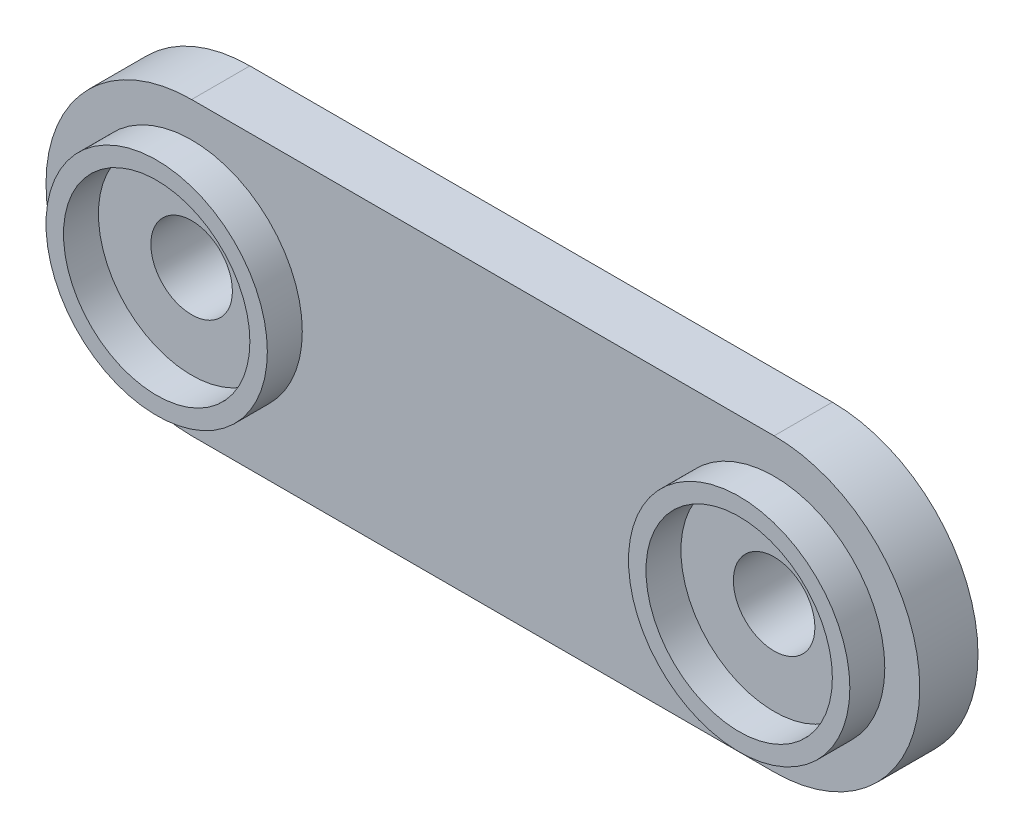
ISO-10303-21;
HEADER;
FILE_DESCRIPTION(('STEP AP214'),'2;1');
FILE_NAME('part.step','',(''),(''),'','','');
FILE_SCHEMA(('AUTOMOTIVE_DESIGN { 1 0 10303 214 1 1 1 1 }'));
ENDSEC;
DATA;
#1=APPLICATION_CONTEXT('core data for automotive mechanical design processes');
#2=APPLICATION_PROTOCOL_DEFINITION('international standard','automotive_design',2000,#1);
#3=PRODUCT_CONTEXT('',#1,'mechanical');
#4=PRODUCT('Part','Part','',(#3));
#5=PRODUCT_RELATED_PRODUCT_CATEGORY('part','',(#4));
#6=PRODUCT_DEFINITION_FORMATION('','',#4);
#7=PRODUCT_DEFINITION_CONTEXT('part definition',#1,'design');
#8=PRODUCT_DEFINITION('design','',#6,#7);
#9=PRODUCT_DEFINITION_SHAPE('','',#8);
#10=(LENGTH_UNIT() NAMED_UNIT(*) SI_UNIT(.MILLI.,.METRE.));
#11=(NAMED_UNIT(*) PLANE_ANGLE_UNIT() SI_UNIT($,.RADIAN.));
#12=(NAMED_UNIT(*) SI_UNIT($,.STERADIAN.) SOLID_ANGLE_UNIT());
#13=UNCERTAINTY_MEASURE_WITH_UNIT(LENGTH_MEASURE(1.E-05),#10,'distance_accuracy_value','');
#14=(GEOMETRIC_REPRESENTATION_CONTEXT(3) GLOBAL_UNCERTAINTY_ASSIGNED_CONTEXT((#13)) GLOBAL_UNIT_ASSIGNED_CONTEXT((#10,
#11,#12)) REPRESENTATION_CONTEXT('',''));
#15=CARTESIAN_POINT('',(0.,0.,0.));
#16=DIRECTION('',(0.,0.,1.));
#17=DIRECTION('',(1.,0.,0.));
#18=AXIS2_PLACEMENT_3D('',#15,#16,#17);
#19=CARTESIAN_POINT('',(0.,0.,5.));
#20=DIRECTION('',(0.,0.,1.));
#21=DIRECTION('',(1.,0.,0.));
#22=AXIS2_PLACEMENT_3D('',#19,#20,#21);
#23=PLANE('',#22);
#24=DIRECTION('',(1.,0.,0.));
#25=VECTOR('',#24,1.);
#26=CARTESIAN_POINT('',(0.,25.,5.));
#27=LINE('',#26,#25);
#28=CARTESIAN_POINT('',(0.,25.,5.));
#29=VERTEX_POINT('',#28);
#30=CARTESIAN_POINT('',(50.,25.,5.));
#31=VERTEX_POINT('',#30);
#32=EDGE_CURVE('E139',#29,#31,#27,.T.);
#33=ORIENTED_EDGE('',*,*,#32,.F.);
#34=CARTESIAN_POINT('',(0.,12.5,5.));
#35=DIRECTION('',(0.,0.,1.));
#36=DIRECTION('',(1.,0.,0.));
#37=AXIS2_PLACEMENT_3D('',#34,#35,#36);
#38=CIRCLE('',#37,12.5);
#39=CARTESIAN_POINT('',(0.,0.,5.));
#40=VERTEX_POINT('',#39);
#41=EDGE_CURVE('E138',#29,#40,#38,.T.);
#42=ORIENTED_EDGE('',*,*,#41,.T.);
#43=DIRECTION('',(1.,0.,0.));
#44=VECTOR('',#43,1.);
#45=CARTESIAN_POINT('',(0.,0.,5.));
#46=LINE('',#45,#44);
#47=CARTESIAN_POINT('',(50.,0.,5.));
#48=VERTEX_POINT('',#47);
#49=EDGE_CURVE('E125',#40,#48,#46,.T.);
#50=ORIENTED_EDGE('',*,*,#49,.T.);
#51=CARTESIAN_POINT('',(50.,12.5,5.));
#52=DIRECTION('',(0.,0.,1.));
#53=DIRECTION('',(1.,0.,0.));
#54=AXIS2_PLACEMENT_3D('',#51,#52,#53);
#55=CIRCLE('',#54,12.5);
#56=EDGE_CURVE('E130',#48,#31,#55,.T.);
#57=ORIENTED_EDGE('',*,*,#56,.T.);
#58=EDGE_LOOP('',(#33,#42,#50,#57));
#59=FACE_BOUND('',#58,.T.);
#60=CARTESIAN_POINT('',(50.,12.5,5.));
#61=DIRECTION('',(0.,0.,1.));
#62=DIRECTION('',(1.,0.,0.));
#63=AXIS2_PLACEMENT_3D('',#60,#61,#62);
#64=CIRCLE('',#63,9.5);
#65=CARTESIAN_POINT('',(59.5,12.5,5.));
#66=VERTEX_POINT('',#65);
#67=EDGE_CURVE('E227',#66,#66,#64,.T.);
#68=ORIENTED_EDGE('',*,*,#67,.F.);
#69=EDGE_LOOP('',(#68));
#70=FACE_BOUND('',#69,.T.);
#71=CARTESIAN_POINT('',(0.,12.5,5.));
#72=DIRECTION('',(0.,0.,1.));
#73=DIRECTION('',(1.,0.,0.));
#74=AXIS2_PLACEMENT_3D('',#71,#72,#73);
#75=CIRCLE('',#74,9.5);
#76=CARTESIAN_POINT('',(9.5,12.5,5.));
#77=VERTEX_POINT('',#76);
#78=EDGE_CURVE('E12',#77,#77,#75,.T.);
#79=ORIENTED_EDGE('',*,*,#78,.F.);
#80=EDGE_LOOP('',(#79));
#81=FACE_BOUND('',#80,.T.);
#82=ADVANCED_FACE('F74',(#59,#70,#81),#23,.T.);
#83=CARTESIAN_POINT('',(50.,12.5,5.));
#84=DIRECTION('',(0.,0.,1.));
#85=DIRECTION('',(1.,0.,0.));
#86=AXIS2_PLACEMENT_3D('',#83,#84,#85);
#87=CIRCLE('',#86,3.5);
#88=CARTESIAN_POINT('',(53.5,12.5,5.));
#89=VERTEX_POINT('',#88);
#90=EDGE_CURVE('E159',#89,#89,#87,.T.);
#91=ORIENTED_EDGE('',*,*,#90,.F.);
#92=EDGE_LOOP('',(#91));
#93=FACE_BOUND('',#92,.T.);
#94=CARTESIAN_POINT('',(50.,12.5,5.));
#95=DIRECTION('',(0.,0.,1.));
#96=DIRECTION('',(1.,0.,0.));
#97=AXIS2_PLACEMENT_3D('',#94,#95,#96);
#98=CIRCLE('',#97,8.);
#99=CARTESIAN_POINT('',(58.,12.5,5.));
#100=VERTEX_POINT('',#99);
#101=EDGE_CURVE('E78',#100,#100,#98,.F.);
#102=ORIENTED_EDGE('',*,*,#101,.F.);
#103=EDGE_LOOP('',(#102));
#104=FACE_BOUND('',#103,.T.);
#105=ADVANCED_FACE('F172',(#93,#104),#23,.T.);
#106=CARTESIAN_POINT('',(0.,25.,5.));
#107=DIRECTION('',(0.,1.,0.));
#108=DIRECTION('',(-1.,0.,0.));
#109=AXIS2_PLACEMENT_3D('',#106,#107,#108);
#110=PLANE('',#109);
#111=DIRECTION('',(1.,0.,0.));
#112=VECTOR('',#111,1.);
#113=CARTESIAN_POINT('',(0.,25.,0.));
#114=LINE('',#113,#112);
#115=CARTESIAN_POINT('',(0.,25.,0.));
#116=VERTEX_POINT('',#115);
#117=CARTESIAN_POINT('',(50.,25.,0.));
#118=VERTEX_POINT('',#117);
#119=EDGE_CURVE('E145',#116,#118,#114,.T.);
#120=ORIENTED_EDGE('',*,*,#119,.F.);
#121=DIRECTION('',(0.,0.,-1.));
#122=VECTOR('',#121,1.);
#123=CARTESIAN_POINT('',(0.,25.,5.));
#124=LINE('',#123,#122);
#125=EDGE_CURVE('E92',#29,#116,#124,.T.);
#126=ORIENTED_EDGE('',*,*,#125,.F.);
#127=ORIENTED_EDGE('',*,*,#32,.T.);
#128=DIRECTION('',(0.,0.,-1.));
#129=VECTOR('',#128,1.);
#130=CARTESIAN_POINT('',(50.,25.,5.));
#131=LINE('',#130,#129);
#132=EDGE_CURVE('E119',#31,#118,#131,.T.);
#133=ORIENTED_EDGE('',*,*,#132,.T.);
#134=EDGE_LOOP('',(#120,#126,#127,#133));
#135=FACE_BOUND('',#134,.T.);
#136=ADVANCED_FACE('F175',(#135),#110,.T.);
#137=CARTESIAN_POINT('',(0.,0.,5.));
#138=DIRECTION('',(0.,1.,0.));
#139=DIRECTION('',(-1.,0.,0.));
#140=AXIS2_PLACEMENT_3D('',#137,#138,#139);
#141=PLANE('',#140);
#142=DIRECTION('',(1.,0.,0.));
#143=VECTOR('',#142,1.);
#144=CARTESIAN_POINT('',(0.,0.,0.));
#145=LINE('',#144,#143);
#146=CARTESIAN_POINT('',(0.,0.,0.));
#147=VERTEX_POINT('',#146);
#148=CARTESIAN_POINT('',(50.,0.,0.));
#149=VERTEX_POINT('',#148);
#150=EDGE_CURVE('E127',#147,#149,#145,.T.);
#151=ORIENTED_EDGE('',*,*,#150,.T.);
#152=DIRECTION('',(0.,0.,-1.));
#153=VECTOR('',#152,1.);
#154=CARTESIAN_POINT('',(50.,0.,5.));
#155=LINE('',#154,#153);
#156=EDGE_CURVE('E122',#48,#149,#155,.T.);
#157=ORIENTED_EDGE('',*,*,#156,.F.);
#158=ORIENTED_EDGE('',*,*,#49,.F.);
#159=DIRECTION('',(0.,0.,-1.));
#160=VECTOR('',#159,1.);
#161=CARTESIAN_POINT('',(0.,0.,5.));
#162=LINE('',#161,#160);
#163=EDGE_CURVE('E109',#40,#147,#162,.T.);
#164=ORIENTED_EDGE('',*,*,#163,.T.);
#165=EDGE_LOOP('',(#151,#157,#158,#164));
#166=FACE_BOUND('',#165,.T.);
#167=ADVANCED_FACE('F123',(#166),#141,.F.);
#168=CARTESIAN_POINT('',(0.,0.,0.));
#169=DIRECTION('',(0.,0.,1.));
#170=DIRECTION('',(1.,0.,0.));
#171=AXIS2_PLACEMENT_3D('',#168,#169,#170);
#172=PLANE('',#171);
#173=CARTESIAN_POINT('',(0.,12.5,0.));
#174=DIRECTION('',(0.,0.,1.));
#175=DIRECTION('',(1.,0.,0.));
#176=AXIS2_PLACEMENT_3D('',#173,#174,#175);
#177=CIRCLE('',#176,3.5);
#178=CARTESIAN_POINT('',(3.5,12.5,0.));
#179=VERTEX_POINT('',#178);
#180=EDGE_CURVE('E152',#179,#179,#177,.F.);
#181=ORIENTED_EDGE('',*,*,#180,.F.);
#182=EDGE_LOOP('',(#181));
#183=FACE_BOUND('',#182,.T.);
#184=CARTESIAN_POINT('',(50.,12.5,0.));
#185=DIRECTION('',(0.,0.,1.));
#186=DIRECTION('',(1.,0.,0.));
#187=AXIS2_PLACEMENT_3D('',#184,#185,#186);
#188=CIRCLE('',#187,3.5);
#189=CARTESIAN_POINT('',(53.5,12.5,0.));
#190=VERTEX_POINT('',#189);
#191=EDGE_CURVE('E163',#190,#190,#188,.F.);
#192=ORIENTED_EDGE('',*,*,#191,.F.);
#193=EDGE_LOOP('',(#192));
#194=FACE_BOUND('',#193,.T.);
#195=ORIENTED_EDGE('',*,*,#150,.F.);
#196=CARTESIAN_POINT('',(0.,12.5,0.));
#197=DIRECTION('',(0.,0.,1.));
#198=DIRECTION('',(1.,0.,0.));
#199=AXIS2_PLACEMENT_3D('',#196,#197,#198);
#200=CIRCLE('',#199,12.5);
#201=EDGE_CURVE('E133',#116,#147,#200,.T.);
#202=ORIENTED_EDGE('',*,*,#201,.F.);
#203=ORIENTED_EDGE('',*,*,#119,.T.);
#204=CARTESIAN_POINT('',(50.,12.5,0.));
#205=DIRECTION('',(0.,0.,1.));
#206=DIRECTION('',(1.,0.,0.));
#207=AXIS2_PLACEMENT_3D('',#204,#205,#206);
#208=CIRCLE('',#207,12.5);
#209=EDGE_CURVE('E134',#149,#118,#208,.T.);
#210=ORIENTED_EDGE('',*,*,#209,.F.);
#211=EDGE_LOOP('',(#195,#202,#203,#210));
#212=FACE_BOUND('',#211,.T.);
#213=ADVANCED_FACE('F203',(#183,#194,#212),#172,.F.);
#214=CARTESIAN_POINT('',(0.,12.5,5.));
#215=DIRECTION('',(0.,0.,1.));
#216=DIRECTION('',(1.,0.,0.));
#217=AXIS2_PLACEMENT_3D('',#214,#215,#216);
#218=CIRCLE('',#217,8.);
#219=CARTESIAN_POINT('',(8.,12.5,5.));
#220=VERTEX_POINT('',#219);
#221=EDGE_CURVE('E214',#220,#220,#218,.T.);
#222=ORIENTED_EDGE('',*,*,#221,.T.);
#223=EDGE_LOOP('',(#222));
#224=FACE_BOUND('',#223,.T.);
#225=CARTESIAN_POINT('',(0.,12.5,5.));
#226=DIRECTION('',(0.,0.,1.));
#227=DIRECTION('',(1.,0.,0.));
#228=AXIS2_PLACEMENT_3D('',#225,#226,#227);
#229=CIRCLE('',#228,3.5);
#230=CARTESIAN_POINT('',(3.5,12.5,5.));
#231=VERTEX_POINT('',#230);
#232=EDGE_CURVE('E154',#231,#231,#229,.T.);
#233=ORIENTED_EDGE('',*,*,#232,.F.);
#234=EDGE_LOOP('',(#233));
#235=FACE_BOUND('',#234,.T.);
#236=ADVANCED_FACE('F177',(#224,#235),#23,.T.);
#237=CARTESIAN_POINT('',(50.,12.5,5.));
#238=DIRECTION('',(0.,0.,-1.));
#239=DIRECTION('',(-1.,0.,0.));
#240=AXIS2_PLACEMENT_3D('',#237,#238,#239);
#241=CYLINDRICAL_SURFACE('',#240,12.5);
#242=ORIENTED_EDGE('',*,*,#209,.T.);
#243=ORIENTED_EDGE('',*,*,#132,.F.);
#244=ORIENTED_EDGE('',*,*,#56,.F.);
#245=ORIENTED_EDGE('',*,*,#156,.T.);
#246=EDGE_LOOP('',(#242,#243,#244,#245));
#247=FACE_BOUND('',#246,.T.);
#248=ADVANCED_FACE('F76',(#247),#241,.T.);
#249=CARTESIAN_POINT('',(0.,12.5,5.));
#250=DIRECTION('',(0.,0.,-1.));
#251=DIRECTION('',(-1.,0.,0.));
#252=AXIS2_PLACEMENT_3D('',#249,#250,#251);
#253=CYLINDRICAL_SURFACE('',#252,12.5);
#254=ORIENTED_EDGE('',*,*,#125,.T.);
#255=ORIENTED_EDGE('',*,*,#201,.T.);
#256=ORIENTED_EDGE('',*,*,#163,.F.);
#257=ORIENTED_EDGE('',*,*,#41,.F.);
#258=EDGE_LOOP('',(#254,#255,#256,#257));
#259=FACE_BOUND('',#258,.T.);
#260=ADVANCED_FACE('F208',(#259),#253,.T.);
#261=CARTESIAN_POINT('',(50.,12.5,-0.00100000000000013));
#262=DIRECTION('',(0.,0.,1.));
#263=DIRECTION('',(1.,0.,0.));
#264=AXIS2_PLACEMENT_3D('',#261,#262,#263);
#265=CYLINDRICAL_SURFACE('',#264,3.5);
#266=ORIENTED_EDGE('',*,*,#90,.T.);
#267=EDGE_LOOP('',(#266));
#268=FACE_BOUND('',#267,.T.);
#269=ORIENTED_EDGE('',*,*,#191,.T.);
#270=EDGE_LOOP('',(#269));
#271=FACE_BOUND('',#270,.T.);
#272=ADVANCED_FACE('F169',(#268,#271),#265,.F.);
#273=CARTESIAN_POINT('',(0.,12.5,-0.00100000000000013));
#274=DIRECTION('',(0.,0.,1.));
#275=DIRECTION('',(1.,0.,0.));
#276=AXIS2_PLACEMENT_3D('',#273,#274,#275);
#277=CYLINDRICAL_SURFACE('',#276,3.5);
#278=ORIENTED_EDGE('',*,*,#232,.T.);
#279=EDGE_LOOP('',(#278));
#280=FACE_BOUND('',#279,.T.);
#281=ORIENTED_EDGE('',*,*,#180,.T.);
#282=EDGE_LOOP('',(#281));
#283=FACE_BOUND('',#282,.T.);
#284=ADVANCED_FACE('F184',(#280,#283),#277,.F.);
#285=CARTESIAN_POINT('',(50.,12.5,8.));
#286=DIRECTION('',(0.,0.,-1.));
#287=DIRECTION('',(-1.,0.,0.));
#288=AXIS2_PLACEMENT_3D('',#285,#286,#287);
#289=CYLINDRICAL_SURFACE('',#288,8.);
#290=CARTESIAN_POINT('',(50.,12.5,8.));
#291=DIRECTION('',(0.,0.,1.));
#292=DIRECTION('',(1.,0.,0.));
#293=AXIS2_PLACEMENT_3D('',#290,#291,#292);
#294=CIRCLE('',#293,8.);
#295=CARTESIAN_POINT('',(58.,12.5,8.));
#296=VERTEX_POINT('',#295);
#297=EDGE_CURVE('E223',#296,#296,#294,.T.);
#298=ORIENTED_EDGE('',*,*,#297,.T.);
#299=EDGE_LOOP('',(#298));
#300=FACE_BOUND('',#299,.T.);
#301=ORIENTED_EDGE('',*,*,#101,.T.);
#302=EDGE_LOOP('',(#301));
#303=FACE_BOUND('',#302,.T.);
#304=ADVANCED_FACE('F181',(#300,#303),#289,.F.);
#305=CARTESIAN_POINT('',(50.,12.5,8.));
#306=DIRECTION('',(0.,0.,-1.));
#307=DIRECTION('',(-1.,0.,0.));
#308=AXIS2_PLACEMENT_3D('',#305,#306,#307);
#309=CYLINDRICAL_SURFACE('',#308,9.5);
#310=CARTESIAN_POINT('',(50.,12.5,8.));
#311=DIRECTION('',(0.,0.,1.));
#312=DIRECTION('',(1.,0.,0.));
#313=AXIS2_PLACEMENT_3D('',#310,#311,#312);
#314=CIRCLE('',#313,9.5);
#315=CARTESIAN_POINT('',(59.5,12.5,8.));
#316=VERTEX_POINT('',#315);
#317=EDGE_CURVE('E218',#316,#316,#314,.T.);
#318=ORIENTED_EDGE('',*,*,#317,.F.);
#319=EDGE_LOOP('',(#318));
#320=FACE_BOUND('',#319,.T.);
#321=ORIENTED_EDGE('',*,*,#67,.T.);
#322=EDGE_LOOP('',(#321));
#323=FACE_BOUND('',#322,.T.);
#324=ADVANCED_FACE('F183',(#320,#323),#309,.T.);
#325=CARTESIAN_POINT('',(0.,0.,8.));
#326=DIRECTION('',(0.,0.,1.));
#327=DIRECTION('',(1.,0.,0.));
#328=AXIS2_PLACEMENT_3D('',#325,#326,#327);
#329=PLANE('',#328);
#330=ORIENTED_EDGE('',*,*,#297,.F.);
#331=EDGE_LOOP('',(#330));
#332=FACE_BOUND('',#331,.T.);
#333=ORIENTED_EDGE('',*,*,#317,.T.);
#334=EDGE_LOOP('',(#333));
#335=FACE_BOUND('',#334,.T.);
#336=ADVANCED_FACE('F191',(#332,#335),#329,.T.);
#337=CARTESIAN_POINT('',(0.,12.5,8.));
#338=DIRECTION('',(0.,0.,-1.));
#339=DIRECTION('',(-1.,0.,0.));
#340=AXIS2_PLACEMENT_3D('',#337,#338,#339);
#341=CYLINDRICAL_SURFACE('',#340,8.);
#342=CARTESIAN_POINT('',(0.,12.5,8.));
#343=DIRECTION('',(0.,0.,1.));
#344=DIRECTION('',(1.,0.,0.));
#345=AXIS2_PLACEMENT_3D('',#342,#343,#344);
#346=CIRCLE('',#345,8.);
#347=CARTESIAN_POINT('',(8.,12.5,8.));
#348=VERTEX_POINT('',#347);
#349=EDGE_CURVE('E217',#348,#348,#346,.T.);
#350=ORIENTED_EDGE('',*,*,#349,.T.);
#351=EDGE_LOOP('',(#350));
#352=FACE_BOUND('',#351,.T.);
#353=ORIENTED_EDGE('',*,*,#221,.F.);
#354=EDGE_LOOP('',(#353));
#355=FACE_BOUND('',#354,.T.);
#356=ADVANCED_FACE('F237',(#352,#355),#341,.F.);
#357=CARTESIAN_POINT('',(0.,12.5,8.));
#358=DIRECTION('',(0.,0.,-1.));
#359=DIRECTION('',(-1.,0.,0.));
#360=AXIS2_PLACEMENT_3D('',#357,#358,#359);
#361=CYLINDRICAL_SURFACE('',#360,9.5);
#362=CARTESIAN_POINT('',(0.,12.5,8.));
#363=DIRECTION('',(0.,0.,1.));
#364=DIRECTION('',(1.,0.,0.));
#365=AXIS2_PLACEMENT_3D('',#362,#363,#364);
#366=CIRCLE('',#365,9.5);
#367=CARTESIAN_POINT('',(9.5,12.5,8.));
#368=VERTEX_POINT('',#367);
#369=EDGE_CURVE('E165',#368,#368,#366,.T.);
#370=ORIENTED_EDGE('',*,*,#369,.F.);
#371=EDGE_LOOP('',(#370));
#372=FACE_BOUND('',#371,.T.);
#373=ORIENTED_EDGE('',*,*,#78,.T.);
#374=EDGE_LOOP('',(#373));
#375=FACE_BOUND('',#374,.T.);
#376=ADVANCED_FACE('F234',(#372,#375),#361,.T.);
#377=CARTESIAN_POINT('',(0.,0.,8.));
#378=DIRECTION('',(0.,0.,1.));
#379=DIRECTION('',(1.,0.,0.));
#380=AXIS2_PLACEMENT_3D('',#377,#378,#379);
#381=PLANE('',#380);
#382=ORIENTED_EDGE('',*,*,#349,.F.);
#383=EDGE_LOOP('',(#382));
#384=FACE_BOUND('',#383,.T.);
#385=ORIENTED_EDGE('',*,*,#369,.T.);
#386=EDGE_LOOP('',(#385));
#387=FACE_BOUND('',#386,.T.);
#388=ADVANCED_FACE('F236',(#384,#387),#381,.T.);
#389=CLOSED_SHELL('',(#82,#105,#136,#167,#213,#236,#248,#260,#272,#284,#304,#324,#336,#356,#376,#388));
#390=MANIFOLD_SOLID_BREP('B2',#389);
#391=ADVANCED_BREP_SHAPE_REPRESENTATION('',(#18,#390),#14);
#392=SHAPE_DEFINITION_REPRESENTATION(#9,#391);
ENDSEC;
END-ISO-10303-21;
